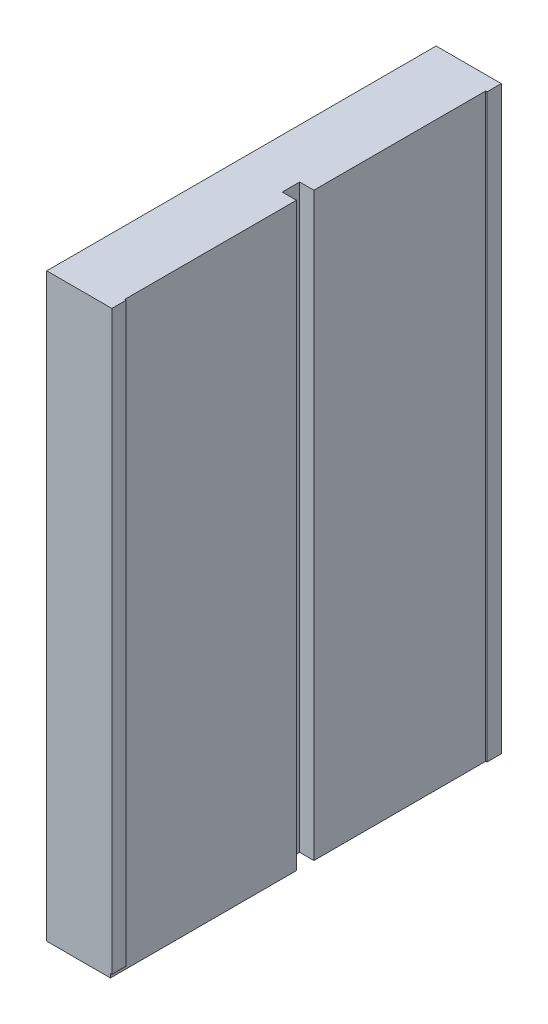
ISO-10303-21;
HEADER;
FILE_DESCRIPTION(('STEP AP214'),'2;1');
FILE_NAME('part.step','',(''),(''),'','','');
FILE_SCHEMA(('AUTOMOTIVE_DESIGN { 1 0 10303 214 1 1 1 1 }'));
ENDSEC;
DATA;
#1=APPLICATION_CONTEXT('core data for automotive mechanical design processes');
#2=APPLICATION_PROTOCOL_DEFINITION('international standard','automotive_design',2000,#1);
#3=PRODUCT_CONTEXT('',#1,'mechanical');
#4=PRODUCT('Part','Part','',(#3));
#5=PRODUCT_RELATED_PRODUCT_CATEGORY('part','',(#4));
#6=PRODUCT_DEFINITION_FORMATION('','',#4);
#7=PRODUCT_DEFINITION_CONTEXT('part definition',#1,'design');
#8=PRODUCT_DEFINITION('design','',#6,#7);
#9=PRODUCT_DEFINITION_SHAPE('','',#8);
#10=(LENGTH_UNIT() NAMED_UNIT(*) SI_UNIT(.MILLI.,.METRE.));
#11=(NAMED_UNIT(*) PLANE_ANGLE_UNIT() SI_UNIT($,.RADIAN.));
#12=(NAMED_UNIT(*) SI_UNIT($,.STERADIAN.) SOLID_ANGLE_UNIT());
#13=UNCERTAINTY_MEASURE_WITH_UNIT(LENGTH_MEASURE(1.E-05),#10,'distance_accuracy_value','');
#14=(GEOMETRIC_REPRESENTATION_CONTEXT(3) GLOBAL_UNCERTAINTY_ASSIGNED_CONTEXT((#13)) GLOBAL_UNIT_ASSIGNED_CONTEXT((#10,
#11,#12)) REPRESENTATION_CONTEXT('',''));
#15=CARTESIAN_POINT('',(0.,0.,0.));
#16=DIRECTION('',(0.,0.,1.));
#17=DIRECTION('',(1.,0.,0.));
#18=AXIS2_PLACEMENT_3D('',#15,#16,#17);
#19=CARTESIAN_POINT('',(4.5,82.,-27.5));
#20=DIRECTION('',(-1.,0.,0.));
#21=DIRECTION('',(0.,0.,1.));
#22=AXIS2_PLACEMENT_3D('',#19,#20,#21);
#23=PLANE('',#22);
#24=DIRECTION('',(0.,0.,-1.));
#25=VECTOR('',#24,1.);
#26=CARTESIAN_POINT('',(4.5,0.545363754795858,0.));
#27=LINE('',#26,#25);
#28=CARTESIAN_POINT('',(4.5,0.545363754795858,27.5));
#29=VERTEX_POINT('',#28);
#30=CARTESIAN_POINT('',(4.5,0.545363754795858,25.5));
#31=VERTEX_POINT('',#30);
#32=EDGE_CURVE('E148',#29,#31,#27,.T.);
#33=ORIENTED_EDGE('',*,*,#32,.F.);
#34=DIRECTION('',(0.,-1.,0.));
#35=VECTOR('',#34,1.);
#36=CARTESIAN_POINT('',(4.5,82.,27.5));
#37=LINE('',#36,#35);
#38=CARTESIAN_POINT('',(4.5,0.,27.5));
#39=VERTEX_POINT('',#38);
#40=EDGE_CURVE('E263',#29,#39,#37,.T.);
#41=ORIENTED_EDGE('',*,*,#40,.T.);
#42=DIRECTION('',(0.,0.,-1.));
#43=VECTOR('',#42,1.);
#44=CARTESIAN_POINT('',(4.5,0.,-27.5));
#45=LINE('',#44,#43);
#46=CARTESIAN_POINT('',(4.5,0.,1.23075702743768));
#47=VERTEX_POINT('',#46);
#48=EDGE_CURVE('E264',#39,#47,#45,.T.);
#49=ORIENTED_EDGE('',*,*,#48,.T.);
#50=DIRECTION('',(0.,-1.,0.));
#51=VECTOR('',#50,1.);
#52=CARTESIAN_POINT('',(4.5,0.,1.23075702743768));
#53=LINE('',#52,#51);
#54=CARTESIAN_POINT('',(4.5,82.,1.23075702743768));
#55=VERTEX_POINT('',#54);
#56=EDGE_CURVE('E214',#55,#47,#53,.T.);
#57=ORIENTED_EDGE('',*,*,#56,.F.);
#58=DIRECTION('',(0.,0.,-1.));
#59=VECTOR('',#58,1.);
#60=CARTESIAN_POINT('',(4.5,82.,-27.5));
#61=LINE('',#60,#59);
#62=CARTESIAN_POINT('',(4.5,82.,25.5));
#63=VERTEX_POINT('',#62);
#64=EDGE_CURVE('E251',#63,#55,#61,.T.);
#65=ORIENTED_EDGE('',*,*,#64,.F.);
#66=DIRECTION('',(0.,-1.,0.));
#67=VECTOR('',#66,1.);
#68=CARTESIAN_POINT('',(4.5,0.,25.5));
#69=LINE('',#68,#67);
#70=EDGE_CURVE('E64',#63,#31,#69,.T.);
#71=ORIENTED_EDGE('',*,*,#70,.T.);
#72=EDGE_LOOP('',(#33,#41,#49,#57,#65,#71));
#73=FACE_BOUND('',#72,.T.);
#74=ADVANCED_FACE('F41',(#73),#23,.F.);
#75=DIRECTION('',(0.,-1.,0.));
#76=VECTOR('',#75,1.);
#77=CARTESIAN_POINT('',(4.5,82.,-27.5));
#78=LINE('',#77,#76);
#79=CARTESIAN_POINT('',(4.5,0.0186037017044782,-27.5));
#80=VERTEX_POINT('',#79);
#81=CARTESIAN_POINT('',(4.5,0.,-27.5));
#82=VERTEX_POINT('',#81);
#83=EDGE_CURVE('E11',#80,#82,#78,.T.);
#84=ORIENTED_EDGE('',*,*,#83,.F.);
#85=DIRECTION('',(0.,0.,1.));
#86=VECTOR('',#85,1.);
#87=CARTESIAN_POINT('',(4.5,0.0186037017044782,0.));
#88=LINE('',#87,#86);
#89=CARTESIAN_POINT('',(4.5,0.0186037017044782,-25.5));
#90=VERTEX_POINT('',#89);
#91=EDGE_CURVE('E56',#80,#90,#88,.T.);
#92=ORIENTED_EDGE('',*,*,#91,.T.);
#93=DIRECTION('',(0.,-1.,0.));
#94=VECTOR('',#93,1.);
#95=CARTESIAN_POINT('',(4.5,0.,-25.5));
#96=LINE('',#95,#94);
#97=CARTESIAN_POINT('',(4.5,82.,-25.5));
#98=VERTEX_POINT('',#97);
#99=EDGE_CURVE('E159',#98,#90,#96,.T.);
#100=ORIENTED_EDGE('',*,*,#99,.F.);
#101=CARTESIAN_POINT('',(4.5,82.,-1.23075702743769));
#102=VERTEX_POINT('',#101);
#103=EDGE_CURVE('E254',#102,#98,#61,.T.);
#104=ORIENTED_EDGE('',*,*,#103,.F.);
#105=DIRECTION('',(0.,-1.,0.));
#106=VECTOR('',#105,1.);
#107=CARTESIAN_POINT('',(4.5,0.,-1.23075702743769));
#108=LINE('',#107,#106);
#109=CARTESIAN_POINT('',(4.5,0.,-1.23075702743769));
#110=VERTEX_POINT('',#109);
#111=EDGE_CURVE('E220',#102,#110,#108,.T.);
#112=ORIENTED_EDGE('',*,*,#111,.T.);
#113=EDGE_CURVE('E240',#110,#82,#45,.T.);
#114=ORIENTED_EDGE('',*,*,#113,.T.);
#115=EDGE_LOOP('',(#84,#92,#100,#104,#112,#114));
#116=FACE_BOUND('',#115,.T.);
#117=ADVANCED_FACE('F331',(#116),#23,.F.);
#118=CARTESIAN_POINT('',(0.,82.,0.));
#119=DIRECTION('',(0.,1.,0.));
#120=DIRECTION('',(0.,0.,1.));
#121=AXIS2_PLACEMENT_3D('',#118,#119,#120);
#122=PLANE('',#121);
#123=DIRECTION('',(0.,0.,1.));
#124=VECTOR('',#123,1.);
#125=CARTESIAN_POINT('',(2.5,82.,0.));
#126=LINE('',#125,#124);
#127=CARTESIAN_POINT('',(2.5,82.,-1.23075702743769));
#128=VERTEX_POINT('',#127);
#129=CARTESIAN_POINT('',(2.5,82.,1.23075702743768));
#130=VERTEX_POINT('',#129);
#131=EDGE_CURVE('E215',#128,#130,#126,.T.);
#132=ORIENTED_EDGE('',*,*,#131,.F.);
#133=DIRECTION('',(1.,0.,0.));
#134=VECTOR('',#133,1.);
#135=CARTESIAN_POINT('',(2.5,82.,-1.23075702743769));
#136=LINE('',#135,#134);
#137=EDGE_CURVE('E236',#128,#102,#136,.T.);
#138=ORIENTED_EDGE('',*,*,#137,.T.);
#139=ORIENTED_EDGE('',*,*,#103,.T.);
#140=DIRECTION('',(-1.,0.,0.));
#141=VECTOR('',#140,1.);
#142=CARTESIAN_POINT('',(4.69999999999999,82.,-25.5));
#143=LINE('',#142,#141);
#144=CARTESIAN_POINT('',(4.69999999999999,82.,-25.5));
#145=VERTEX_POINT('',#144);
#146=EDGE_CURVE('E149',#145,#98,#143,.T.);
#147=ORIENTED_EDGE('',*,*,#146,.F.);
#148=DIRECTION('',(0.,0.,1.));
#149=VECTOR('',#148,1.);
#150=CARTESIAN_POINT('',(4.7,82.,0.));
#151=LINE('',#150,#149);
#152=CARTESIAN_POINT('',(4.69999999999999,82.,-27.5));
#153=VERTEX_POINT('',#152);
#154=EDGE_CURVE('E166',#153,#145,#151,.T.);
#155=ORIENTED_EDGE('',*,*,#154,.F.);
#156=DIRECTION('',(-1.,0.,0.));
#157=VECTOR('',#156,1.);
#158=CARTESIAN_POINT('',(-4.5,82.,-27.5));
#159=LINE('',#158,#157);
#160=CARTESIAN_POINT('',(-4.5,82.,-27.5));
#161=VERTEX_POINT('',#160);
#162=EDGE_CURVE('E163',#153,#161,#159,.T.);
#163=ORIENTED_EDGE('',*,*,#162,.T.);
#164=DIRECTION('',(0.,0.,1.));
#165=VECTOR('',#164,1.);
#166=CARTESIAN_POINT('',(-4.5,82.,-27.5));
#167=LINE('',#166,#165);
#168=CARTESIAN_POINT('',(-4.5,82.,27.5));
#169=VERTEX_POINT('',#168);
#170=EDGE_CURVE('E257',#161,#169,#167,.T.);
#171=ORIENTED_EDGE('',*,*,#170,.T.);
#172=DIRECTION('',(1.,0.,0.));
#173=VECTOR('',#172,1.);
#174=CARTESIAN_POINT('',(-4.5,82.,27.5));
#175=LINE('',#174,#173);
#176=CARTESIAN_POINT('',(4.7,82.,27.5));
#177=VERTEX_POINT('',#176);
#178=EDGE_CURVE('E260',#169,#177,#175,.T.);
#179=ORIENTED_EDGE('',*,*,#178,.T.);
#180=DIRECTION('',(0.,0.,1.));
#181=VECTOR('',#180,1.);
#182=CARTESIAN_POINT('',(4.7,82.,0.));
#183=LINE('',#182,#181);
#184=CARTESIAN_POINT('',(4.7,82.,25.5));
#185=VERTEX_POINT('',#184);
#186=EDGE_CURVE('E194',#185,#177,#183,.T.);
#187=ORIENTED_EDGE('',*,*,#186,.F.);
#188=DIRECTION('',(-1.,0.,0.));
#189=VECTOR('',#188,1.);
#190=CARTESIAN_POINT('',(4.7,82.,25.5));
#191=LINE('',#190,#189);
#192=EDGE_CURVE('E198',#185,#63,#191,.T.);
#193=ORIENTED_EDGE('',*,*,#192,.T.);
#194=ORIENTED_EDGE('',*,*,#64,.T.);
#195=DIRECTION('',(1.,0.,0.));
#196=VECTOR('',#195,1.);
#197=CARTESIAN_POINT('',(2.5,82.,1.23075702743768));
#198=LINE('',#197,#196);
#199=EDGE_CURVE('E230',#130,#55,#198,.T.);
#200=ORIENTED_EDGE('',*,*,#199,.F.);
#201=EDGE_LOOP('',(#132,#138,#139,#147,#155,#163,#171,#179,#187,#193,#194,#200));
#202=FACE_BOUND('',#201,.T.);
#203=ADVANCED_FACE('F305',(#202),#122,.T.);
#204=CARTESIAN_POINT('',(0.,0.,0.));
#205=DIRECTION('',(0.,1.,0.));
#206=DIRECTION('',(0.,0.,1.));
#207=AXIS2_PLACEMENT_3D('',#204,#205,#206);
#208=PLANE('',#207);
#209=DIRECTION('',(1.,0.,0.));
#210=VECTOR('',#209,1.);
#211=CARTESIAN_POINT('',(2.5,0.,-1.23075702743769));
#212=LINE('',#211,#210);
#213=CARTESIAN_POINT('',(2.5,0.,-1.23075702743769));
#214=VERTEX_POINT('',#213);
#215=EDGE_CURVE('E241',#214,#110,#212,.T.);
#216=ORIENTED_EDGE('',*,*,#215,.F.);
#217=DIRECTION('',(0.,0.,-1.));
#218=VECTOR('',#217,1.);
#219=CARTESIAN_POINT('',(2.5,0.,0.));
#220=LINE('',#219,#218);
#221=CARTESIAN_POINT('',(2.5,0.,1.23075702743768));
#222=VERTEX_POINT('',#221);
#223=EDGE_CURVE('E223',#222,#214,#220,.T.);
#224=ORIENTED_EDGE('',*,*,#223,.F.);
#225=DIRECTION('',(1.,0.,0.));
#226=VECTOR('',#225,1.);
#227=CARTESIAN_POINT('',(2.5,0.,1.23075702743768));
#228=LINE('',#227,#226);
#229=EDGE_CURVE('E244',#222,#47,#228,.T.);
#230=ORIENTED_EDGE('',*,*,#229,.T.);
#231=ORIENTED_EDGE('',*,*,#48,.F.);
#232=DIRECTION('',(1.,0.,0.));
#233=VECTOR('',#232,1.);
#234=CARTESIAN_POINT('',(-4.5,0.,27.5));
#235=LINE('',#234,#233);
#236=CARTESIAN_POINT('',(-4.5,0.,27.5));
#237=VERTEX_POINT('',#236);
#238=EDGE_CURVE('E274',#237,#39,#235,.T.);
#239=ORIENTED_EDGE('',*,*,#238,.F.);
#240=DIRECTION('',(0.,0.,1.));
#241=VECTOR('',#240,1.);
#242=CARTESIAN_POINT('',(-4.5,0.,-27.5));
#243=LINE('',#242,#241);
#244=CARTESIAN_POINT('',(-4.5,0.,-27.5));
#245=VERTEX_POINT('',#244);
#246=EDGE_CURVE('E271',#245,#237,#243,.T.);
#247=ORIENTED_EDGE('',*,*,#246,.F.);
#248=DIRECTION('',(-1.,0.,0.));
#249=VECTOR('',#248,1.);
#250=CARTESIAN_POINT('',(-4.5,0.,-27.5));
#251=LINE('',#250,#249);
#252=EDGE_CURVE('E268',#82,#245,#251,.T.);
#253=ORIENTED_EDGE('',*,*,#252,.F.);
#254=ORIENTED_EDGE('',*,*,#113,.F.);
#255=EDGE_LOOP('',(#216,#224,#230,#231,#239,#247,#253,#254));
#256=FACE_BOUND('',#255,.T.);
#257=ADVANCED_FACE('F294',(#256),#208,.F.);
#258=CARTESIAN_POINT('',(-4.5,82.,-27.5));
#259=DIRECTION('',(0.,0.,1.));
#260=DIRECTION('',(1.,0.,0.));
#261=AXIS2_PLACEMENT_3D('',#258,#259,#260);
#262=PLANE('',#261);
#263=ORIENTED_EDGE('',*,*,#252,.T.);
#264=DIRECTION('',(0.,-1.,0.));
#265=VECTOR('',#264,1.);
#266=CARTESIAN_POINT('',(-4.5,82.,-27.5));
#267=LINE('',#266,#265);
#268=EDGE_CURVE('E49',#161,#245,#267,.T.);
#269=ORIENTED_EDGE('',*,*,#268,.F.);
#270=ORIENTED_EDGE('',*,*,#162,.F.);
#271=DIRECTION('',(0.,-1.,0.));
#272=VECTOR('',#271,1.);
#273=CARTESIAN_POINT('',(4.69999999999999,0.,-27.5));
#274=LINE('',#273,#272);
#275=CARTESIAN_POINT('',(4.69999999999999,0.0186037017044782,-27.5));
#276=VERTEX_POINT('',#275);
#277=EDGE_CURVE('E154',#153,#276,#274,.T.);
#278=ORIENTED_EDGE('',*,*,#277,.T.);
#279=DIRECTION('',(-1.,0.,0.));
#280=VECTOR('',#279,1.);
#281=CARTESIAN_POINT('',(4.69999999999999,0.0186037017044782,-27.5));
#282=LINE('',#281,#280);
#283=EDGE_CURVE('E140',#276,#80,#282,.T.);
#284=ORIENTED_EDGE('',*,*,#283,.T.);
#285=ORIENTED_EDGE('',*,*,#83,.T.);
#286=EDGE_LOOP('',(#263,#269,#270,#278,#284,#285));
#287=FACE_BOUND('',#286,.T.);
#288=ADVANCED_FACE('F161',(#287),#262,.F.);
#289=CARTESIAN_POINT('',(-4.5,82.,-27.5));
#290=DIRECTION('',(1.,0.,0.));
#291=DIRECTION('',(0.,0.,-1.));
#292=AXIS2_PLACEMENT_3D('',#289,#290,#291);
#293=PLANE('',#292);
#294=ORIENTED_EDGE('',*,*,#246,.T.);
#295=DIRECTION('',(0.,-1.,0.));
#296=VECTOR('',#295,1.);
#297=CARTESIAN_POINT('',(-4.5,82.,27.5));
#298=LINE('',#297,#296);
#299=EDGE_CURVE('E280',#169,#237,#298,.T.);
#300=ORIENTED_EDGE('',*,*,#299,.F.);
#301=ORIENTED_EDGE('',*,*,#170,.F.);
#302=ORIENTED_EDGE('',*,*,#268,.T.);
#303=EDGE_LOOP('',(#294,#300,#301,#302));
#304=FACE_BOUND('',#303,.T.);
#305=ADVANCED_FACE('F288',(#304),#293,.F.);
#306=CARTESIAN_POINT('',(-4.5,82.,27.5));
#307=DIRECTION('',(0.,0.,-1.));
#308=DIRECTION('',(-1.,0.,0.));
#309=AXIS2_PLACEMENT_3D('',#306,#307,#308);
#310=PLANE('',#309);
#311=ORIENTED_EDGE('',*,*,#238,.T.);
#312=ORIENTED_EDGE('',*,*,#40,.F.);
#313=DIRECTION('',(-1.,0.,0.));
#314=VECTOR('',#313,1.);
#315=CARTESIAN_POINT('',(4.7,0.545363754795858,27.5));
#316=LINE('',#315,#314);
#317=CARTESIAN_POINT('',(4.7,0.545363754795858,27.5));
#318=VERTEX_POINT('',#317);
#319=EDGE_CURVE('E210',#318,#29,#316,.T.);
#320=ORIENTED_EDGE('',*,*,#319,.F.);
#321=DIRECTION('',(0.,-1.,0.));
#322=VECTOR('',#321,1.);
#323=CARTESIAN_POINT('',(4.7,0.,27.5));
#324=LINE('',#323,#322);
#325=EDGE_CURVE('E183',#177,#318,#324,.T.);
#326=ORIENTED_EDGE('',*,*,#325,.F.);
#327=ORIENTED_EDGE('',*,*,#178,.F.);
#328=ORIENTED_EDGE('',*,*,#299,.T.);
#329=EDGE_LOOP('',(#311,#312,#320,#326,#327,#328));
#330=FACE_BOUND('',#329,.T.);
#331=ADVANCED_FACE('F298',(#330),#310,.F.);
#332=CARTESIAN_POINT('',(2.5,0.,-1.23075702743769));
#333=DIRECTION('',(0.,0.,1.));
#334=DIRECTION('',(1.,0.,0.));
#335=AXIS2_PLACEMENT_3D('',#332,#333,#334);
#336=PLANE('',#335);
#337=ORIENTED_EDGE('',*,*,#111,.F.);
#338=ORIENTED_EDGE('',*,*,#137,.F.);
#339=DIRECTION('',(0.,-1.,0.));
#340=VECTOR('',#339,1.);
#341=CARTESIAN_POINT('',(2.5,0.,-1.23075702743769));
#342=LINE('',#341,#340);
#343=EDGE_CURVE('E227',#128,#214,#342,.T.);
#344=ORIENTED_EDGE('',*,*,#343,.T.);
#345=ORIENTED_EDGE('',*,*,#215,.T.);
#346=EDGE_LOOP('',(#337,#338,#344,#345));
#347=FACE_BOUND('',#346,.T.);
#348=ADVANCED_FACE('F402',(#347),#336,.T.);
#349=CARTESIAN_POINT('',(2.5,0.,1.23075702743768));
#350=DIRECTION('',(0.,0.,1.));
#351=DIRECTION('',(1.,0.,0.));
#352=AXIS2_PLACEMENT_3D('',#349,#350,#351);
#353=PLANE('',#352);
#354=ORIENTED_EDGE('',*,*,#56,.T.);
#355=ORIENTED_EDGE('',*,*,#229,.F.);
#356=DIRECTION('',(0.,-1.,0.));
#357=VECTOR('',#356,1.);
#358=CARTESIAN_POINT('',(2.5,0.,1.23075702743768));
#359=LINE('',#358,#357);
#360=EDGE_CURVE('E219',#130,#222,#359,.T.);
#361=ORIENTED_EDGE('',*,*,#360,.F.);
#362=ORIENTED_EDGE('',*,*,#199,.T.);
#363=EDGE_LOOP('',(#354,#355,#361,#362));
#364=FACE_BOUND('',#363,.T.);
#365=ADVANCED_FACE('F315',(#364),#353,.F.);
#366=CARTESIAN_POINT('',(2.5,0.,0.));
#367=DIRECTION('',(1.,0.,0.));
#368=DIRECTION('',(0.,0.,-1.));
#369=AXIS2_PLACEMENT_3D('',#366,#367,#368);
#370=PLANE('',#369);
#371=ORIENTED_EDGE('',*,*,#131,.T.);
#372=ORIENTED_EDGE('',*,*,#360,.T.);
#373=ORIENTED_EDGE('',*,*,#223,.T.);
#374=ORIENTED_EDGE('',*,*,#343,.F.);
#375=EDGE_LOOP('',(#371,#372,#373,#374));
#376=FACE_BOUND('',#375,.T.);
#377=ADVANCED_FACE('F320',(#376),#370,.T.);
#378=CARTESIAN_POINT('',(4.7,0.545363754795858,0.));
#379=DIRECTION('',(0.,1.,0.));
#380=DIRECTION('',(0.,0.,1.));
#381=AXIS2_PLACEMENT_3D('',#378,#379,#380);
#382=PLANE('',#381);
#383=ORIENTED_EDGE('',*,*,#32,.T.);
#384=DIRECTION('',(-1.,0.,0.));
#385=VECTOR('',#384,1.);
#386=CARTESIAN_POINT('',(4.7,0.545363754795858,25.5));
#387=LINE('',#386,#385);
#388=CARTESIAN_POINT('',(4.7,0.545363754795858,25.5));
#389=VERTEX_POINT('',#388);
#390=EDGE_CURVE('E207',#389,#31,#387,.T.);
#391=ORIENTED_EDGE('',*,*,#390,.F.);
#392=DIRECTION('',(0.,0.,-1.));
#393=VECTOR('',#392,1.);
#394=CARTESIAN_POINT('',(4.7,0.545363754795858,0.));
#395=LINE('',#394,#393);
#396=EDGE_CURVE('E187',#318,#389,#395,.T.);
#397=ORIENTED_EDGE('',*,*,#396,.F.);
#398=ORIENTED_EDGE('',*,*,#319,.T.);
#399=EDGE_LOOP('',(#383,#391,#397,#398));
#400=FACE_BOUND('',#399,.T.);
#401=ADVANCED_FACE('F318',(#400),#382,.F.);
#402=CARTESIAN_POINT('',(4.7,0.,25.5));
#403=DIRECTION('',(0.,0.,-1.));
#404=DIRECTION('',(-1.,0.,0.));
#405=AXIS2_PLACEMENT_3D('',#402,#403,#404);
#406=PLANE('',#405);
#407=ORIENTED_EDGE('',*,*,#70,.F.);
#408=ORIENTED_EDGE('',*,*,#192,.F.);
#409=DIRECTION('',(0.,-1.,0.));
#410=VECTOR('',#409,1.);
#411=CARTESIAN_POINT('',(4.7,0.,25.5));
#412=LINE('',#411,#410);
#413=EDGE_CURVE('E190',#185,#389,#412,.T.);
#414=ORIENTED_EDGE('',*,*,#413,.T.);
#415=ORIENTED_EDGE('',*,*,#390,.T.);
#416=EDGE_LOOP('',(#407,#408,#414,#415));
#417=FACE_BOUND('',#416,.T.);
#418=ADVANCED_FACE('F311',(#417),#406,.T.);
#419=CARTESIAN_POINT('',(4.7,0.,0.));
#420=DIRECTION('',(1.,0.,0.));
#421=DIRECTION('',(0.,0.,-1.));
#422=AXIS2_PLACEMENT_3D('',#419,#420,#421);
#423=PLANE('',#422);
#424=ORIENTED_EDGE('',*,*,#325,.T.);
#425=ORIENTED_EDGE('',*,*,#396,.T.);
#426=ORIENTED_EDGE('',*,*,#413,.F.);
#427=ORIENTED_EDGE('',*,*,#186,.T.);
#428=EDGE_LOOP('',(#424,#425,#426,#427));
#429=FACE_BOUND('',#428,.T.);
#430=ADVANCED_FACE('F308',(#429),#423,.T.);
#431=CARTESIAN_POINT('',(4.7,0.0186037017044782,0.));
#432=DIRECTION('',(0.,-1.,0.));
#433=DIRECTION('',(0.,0.,-1.));
#434=AXIS2_PLACEMENT_3D('',#431,#432,#433);
#435=PLANE('',#434);
#436=ORIENTED_EDGE('',*,*,#91,.F.);
#437=ORIENTED_EDGE('',*,*,#283,.F.);
#438=DIRECTION('',(0.,0.,1.));
#439=VECTOR('',#438,1.);
#440=CARTESIAN_POINT('',(4.7,0.0186037017044782,0.));
#441=LINE('',#440,#439);
#442=CARTESIAN_POINT('',(4.69999999999999,0.0186037017044782,-25.5));
#443=VERTEX_POINT('',#442);
#444=EDGE_CURVE('E143',#276,#443,#441,.T.);
#445=ORIENTED_EDGE('',*,*,#444,.T.);
#446=DIRECTION('',(-1.,0.,0.));
#447=VECTOR('',#446,1.);
#448=CARTESIAN_POINT('',(4.69999999999999,0.0186037017044782,-25.5));
#449=LINE('',#448,#447);
#450=EDGE_CURVE('E173',#443,#90,#449,.T.);
#451=ORIENTED_EDGE('',*,*,#450,.T.);
#452=EDGE_LOOP('',(#436,#437,#445,#451));
#453=FACE_BOUND('',#452,.T.);
#454=ADVANCED_FACE('F142',(#453),#435,.T.);
#455=CARTESIAN_POINT('',(4.69999999999999,0.,-25.5));
#456=DIRECTION('',(0.,0.,-1.));
#457=DIRECTION('',(0.,1.,0.));
#458=AXIS2_PLACEMENT_3D('',#455,#456,#457);
#459=PLANE('',#458);
#460=ORIENTED_EDGE('',*,*,#99,.T.);
#461=ORIENTED_EDGE('',*,*,#450,.F.);
#462=DIRECTION('',(0.,-1.,0.));
#463=VECTOR('',#462,1.);
#464=CARTESIAN_POINT('',(4.69999999999999,0.,-25.5));
#465=LINE('',#464,#463);
#466=EDGE_CURVE('E156',#145,#443,#465,.T.);
#467=ORIENTED_EDGE('',*,*,#466,.F.);
#468=ORIENTED_EDGE('',*,*,#146,.T.);
#469=EDGE_LOOP('',(#460,#461,#467,#468));
#470=FACE_BOUND('',#469,.T.);
#471=ADVANCED_FACE('F350',(#470),#459,.F.);
#472=CARTESIAN_POINT('',(4.7,0.,0.));
#473=DIRECTION('',(1.,0.,0.));
#474=DIRECTION('',(0.,0.,-1.));
#475=AXIS2_PLACEMENT_3D('',#472,#473,#474);
#476=PLANE('',#475);
#477=ORIENTED_EDGE('',*,*,#444,.F.);
#478=ORIENTED_EDGE('',*,*,#277,.F.);
#479=ORIENTED_EDGE('',*,*,#154,.T.);
#480=ORIENTED_EDGE('',*,*,#466,.T.);
#481=EDGE_LOOP('',(#477,#478,#479,#480));
#482=FACE_BOUND('',#481,.T.);
#483=ADVANCED_FACE('F153',(#482),#476,.T.);
#484=CLOSED_SHELL('',(#74,#117,#203,#257,#288,#305,#331,#348,#365,#377,#401,#418,#430,#454,#471,#483));
#485=MANIFOLD_SOLID_BREP('B2',#484);
#486=ADVANCED_BREP_SHAPE_REPRESENTATION('',(#18,#485),#14);
#487=SHAPE_DEFINITION_REPRESENTATION(#9,#486);
ENDSEC;
END-ISO-10303-21;
